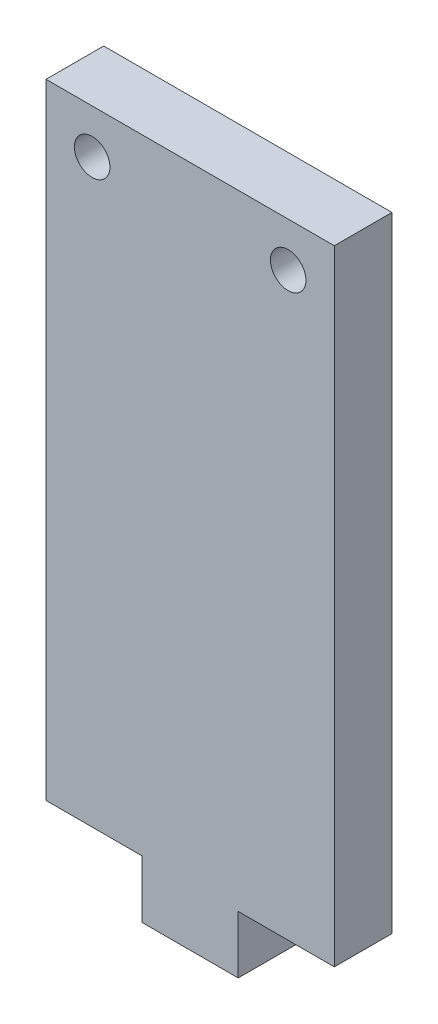
ISO-10303-21;
HEADER;
FILE_DESCRIPTION(('STEP AP214'),'2;1');
FILE_NAME('part.step','',(''),(''),'','','');
FILE_SCHEMA(('AUTOMOTIVE_DESIGN { 1 0 10303 214 1 1 1 1 }'));
ENDSEC;
DATA;
#1=APPLICATION_CONTEXT('core data for automotive mechanical design processes');
#2=APPLICATION_PROTOCOL_DEFINITION('international standard','automotive_design',2000,#1);
#3=PRODUCT_CONTEXT('',#1,'mechanical');
#4=PRODUCT('Part','Part','',(#3));
#5=PRODUCT_RELATED_PRODUCT_CATEGORY('part','',(#4));
#6=PRODUCT_DEFINITION_FORMATION('','',#4);
#7=PRODUCT_DEFINITION_CONTEXT('part definition',#1,'design');
#8=PRODUCT_DEFINITION('design','',#6,#7);
#9=PRODUCT_DEFINITION_SHAPE('','',#8);
#10=(LENGTH_UNIT() NAMED_UNIT(*) SI_UNIT(.MILLI.,.METRE.));
#11=(NAMED_UNIT(*) PLANE_ANGLE_UNIT() SI_UNIT($,.RADIAN.));
#12=(NAMED_UNIT(*) SI_UNIT($,.STERADIAN.) SOLID_ANGLE_UNIT());
#13=UNCERTAINTY_MEASURE_WITH_UNIT(LENGTH_MEASURE(1.E-05),#10,'distance_accuracy_value','');
#14=(GEOMETRIC_REPRESENTATION_CONTEXT(3) GLOBAL_UNCERTAINTY_ASSIGNED_CONTEXT((#13)) GLOBAL_UNIT_ASSIGNED_CONTEXT((#10,
#11,#12)) REPRESENTATION_CONTEXT('',''));
#15=CARTESIAN_POINT('',(0.,0.,0.));
#16=DIRECTION('',(0.,0.,1.));
#17=DIRECTION('',(1.,0.,0.));
#18=AXIS2_PLACEMENT_3D('',#15,#16,#17);
#19=CARTESIAN_POINT('',(0.,0.,6.));
#20=DIRECTION('',(-1.,0.,0.));
#21=DIRECTION('',(0.,-1.,0.));
#22=AXIS2_PLACEMENT_3D('',#19,#20,#21);
#23=PLANE('',#22);
#24=DIRECTION('',(0.,1.,0.));
#25=VECTOR('',#24,1.);
#26=CARTESIAN_POINT('',(0.,0.,6.));
#27=LINE('',#26,#25);
#28=CARTESIAN_POINT('',(0.,6.,6.));
#29=VERTEX_POINT('',#28);
#30=CARTESIAN_POINT('',(0.,71.,6.));
#31=VERTEX_POINT('',#30);
#32=EDGE_CURVE('E124',#29,#31,#27,.T.);
#33=ORIENTED_EDGE('',*,*,#32,.F.);
#34=DIRECTION('',(0.,0.,-1.));
#35=VECTOR('',#34,1.);
#36=CARTESIAN_POINT('',(0.,6.,6.));
#37=LINE('',#36,#35);
#38=CARTESIAN_POINT('',(0.,6.,0.));
#39=VERTEX_POINT('',#38);
#40=EDGE_CURVE('E131',#29,#39,#37,.T.);
#41=ORIENTED_EDGE('',*,*,#40,.T.);
#42=DIRECTION('',(0.,1.,0.));
#43=VECTOR('',#42,1.);
#44=CARTESIAN_POINT('',(0.,0.,0.));
#45=LINE('',#44,#43);
#46=CARTESIAN_POINT('',(0.,71.,0.));
#47=VERTEX_POINT('',#46);
#48=EDGE_CURVE('E128',#39,#47,#45,.T.);
#49=ORIENTED_EDGE('',*,*,#48,.T.);
#50=DIRECTION('',(0.,0.,-1.));
#51=VECTOR('',#50,1.);
#52=CARTESIAN_POINT('',(0.,71.,6.));
#53=LINE('',#52,#51);
#54=EDGE_CURVE('E11',#31,#47,#53,.T.);
#55=ORIENTED_EDGE('',*,*,#54,.F.);
#56=EDGE_LOOP('',(#33,#41,#49,#55));
#57=FACE_BOUND('',#56,.T.);
#58=ADVANCED_FACE('F33',(#57),#23,.F.);
#59=CARTESIAN_POINT('',(0.,71.,6.));
#60=DIRECTION('',(0.,-1.,0.));
#61=DIRECTION('',(0.,0.,-1.));
#62=AXIS2_PLACEMENT_3D('',#59,#60,#61);
#63=PLANE('',#62);
#64=DIRECTION('',(-1.,0.,0.));
#65=VECTOR('',#64,1.);
#66=CARTESIAN_POINT('',(0.,71.,0.));
#67=LINE('',#66,#65);
#68=CARTESIAN_POINT('',(-30.,71.,0.));
#69=VERTEX_POINT('',#68);
#70=EDGE_CURVE('E130',#47,#69,#67,.T.);
#71=ORIENTED_EDGE('',*,*,#70,.T.);
#72=DIRECTION('',(0.,0.,-1.));
#73=VECTOR('',#72,1.);
#74=CARTESIAN_POINT('',(-30.,71.,6.));
#75=LINE('',#74,#73);
#76=CARTESIAN_POINT('',(-30.,71.,6.));
#77=VERTEX_POINT('',#76);
#78=EDGE_CURVE('E40',#77,#69,#75,.T.);
#79=ORIENTED_EDGE('',*,*,#78,.F.);
#80=DIRECTION('',(-1.,0.,0.));
#81=VECTOR('',#80,1.);
#82=CARTESIAN_POINT('',(0.,71.,6.));
#83=LINE('',#82,#81);
#84=EDGE_CURVE('E119',#31,#77,#83,.T.);
#85=ORIENTED_EDGE('',*,*,#84,.F.);
#86=ORIENTED_EDGE('',*,*,#54,.T.);
#87=EDGE_LOOP('',(#71,#79,#85,#86));
#88=FACE_BOUND('',#87,.T.);
#89=ADVANCED_FACE('F172',(#88),#63,.F.);
#90=CARTESIAN_POINT('',(-30.,0.,6.));
#91=DIRECTION('',(1.,0.,0.));
#92=DIRECTION('',(0.,0.,-1.));
#93=AXIS2_PLACEMENT_3D('',#90,#91,#92);
#94=PLANE('',#93);
#95=DIRECTION('',(0.,-1.,0.));
#96=VECTOR('',#95,1.);
#97=CARTESIAN_POINT('',(-30.,0.,0.));
#98=LINE('',#97,#96);
#99=CARTESIAN_POINT('',(-30.,6.,0.));
#100=VERTEX_POINT('',#99);
#101=EDGE_CURVE('E115',#69,#100,#98,.T.);
#102=ORIENTED_EDGE('',*,*,#101,.T.);
#103=DIRECTION('',(0.,0.,-1.));
#104=VECTOR('',#103,1.);
#105=CARTESIAN_POINT('',(-30.,6.,6.));
#106=LINE('',#105,#104);
#107=CARTESIAN_POINT('',(-30.,6.,6.));
#108=VERTEX_POINT('',#107);
#109=EDGE_CURVE('E47',#108,#100,#106,.T.);
#110=ORIENTED_EDGE('',*,*,#109,.F.);
#111=DIRECTION('',(0.,-1.,0.));
#112=VECTOR('',#111,1.);
#113=CARTESIAN_POINT('',(-30.,0.,6.));
#114=LINE('',#113,#112);
#115=EDGE_CURVE('E113',#77,#108,#114,.T.);
#116=ORIENTED_EDGE('',*,*,#115,.F.);
#117=ORIENTED_EDGE('',*,*,#78,.T.);
#118=EDGE_LOOP('',(#102,#110,#116,#117));
#119=FACE_BOUND('',#118,.T.);
#120=ADVANCED_FACE('F111',(#119),#94,.F.);
#121=CARTESIAN_POINT('',(0.,0.,6.));
#122=DIRECTION('',(0.,1.,0.));
#123=DIRECTION('',(-1.,0.,0.));
#124=AXIS2_PLACEMENT_3D('',#121,#122,#123);
#125=PLANE('',#124);
#126=DIRECTION('',(1.,0.,0.));
#127=VECTOR('',#126,1.);
#128=CARTESIAN_POINT('',(0.,0.,6.));
#129=LINE('',#128,#127);
#130=CARTESIAN_POINT('',(-20.,0.,6.));
#131=VERTEX_POINT('',#130);
#132=CARTESIAN_POINT('',(-10.,0.,6.));
#133=VERTEX_POINT('',#132);
#134=EDGE_CURVE('E121',#131,#133,#129,.T.);
#135=ORIENTED_EDGE('',*,*,#134,.F.);
#136=DIRECTION('',(0.,0.,-1.));
#137=VECTOR('',#136,1.);
#138=CARTESIAN_POINT('',(-20.,0.,6.));
#139=LINE('',#138,#137);
#140=CARTESIAN_POINT('',(-20.,0.,0.));
#141=VERTEX_POINT('',#140);
#142=EDGE_CURVE('E149',#131,#141,#139,.T.);
#143=ORIENTED_EDGE('',*,*,#142,.T.);
#144=DIRECTION('',(1.,0.,0.));
#145=VECTOR('',#144,1.);
#146=CARTESIAN_POINT('',(0.,0.,0.));
#147=LINE('',#146,#145);
#148=CARTESIAN_POINT('',(-10.,0.,0.));
#149=VERTEX_POINT('',#148);
#150=EDGE_CURVE('E55',#141,#149,#147,.T.);
#151=ORIENTED_EDGE('',*,*,#150,.T.);
#152=DIRECTION('',(0.,0.,-1.));
#153=VECTOR('',#152,1.);
#154=CARTESIAN_POINT('',(-10.,0.,6.));
#155=LINE('',#154,#153);
#156=EDGE_CURVE('E160',#133,#149,#155,.T.);
#157=ORIENTED_EDGE('',*,*,#156,.F.);
#158=EDGE_LOOP('',(#135,#143,#151,#157));
#159=FACE_BOUND('',#158,.T.);
#160=ADVANCED_FACE('F181',(#159),#125,.F.);
#161=CARTESIAN_POINT('',(0.,0.,6.));
#162=DIRECTION('',(0.,0.,1.));
#163=DIRECTION('',(1.,0.,0.));
#164=AXIS2_PLACEMENT_3D('',#161,#162,#163);
#165=PLANE('',#164);
#166=CARTESIAN_POINT('',(-25.2,66.4,6.));
#167=DIRECTION('',(0.,0.,-1.));
#168=DIRECTION('',(-1.,0.,0.));
#169=AXIS2_PLACEMENT_3D('',#166,#167,#168);
#170=CIRCLE('',#169,1.85);
#171=CARTESIAN_POINT('',(-27.05,66.4,6.));
#172=VERTEX_POINT('',#171);
#173=EDGE_CURVE('E255',#172,#172,#170,.T.);
#174=ORIENTED_EDGE('',*,*,#173,.T.);
#175=EDGE_LOOP('',(#174));
#176=FACE_BOUND('',#175,.T.);
#177=CARTESIAN_POINT('',(-4.8,66.4,6.));
#178=DIRECTION('',(0.,0.,-1.));
#179=DIRECTION('',(-1.,0.,0.));
#180=AXIS2_PLACEMENT_3D('',#177,#178,#179);
#181=CIRCLE('',#180,1.85);
#182=CARTESIAN_POINT('',(-6.65,66.4,6.));
#183=VERTEX_POINT('',#182);
#184=EDGE_CURVE('E141',#183,#183,#181,.T.);
#185=ORIENTED_EDGE('',*,*,#184,.T.);
#186=EDGE_LOOP('',(#185));
#187=FACE_BOUND('',#186,.T.);
#188=DIRECTION('',(0.,-1.,0.));
#189=VECTOR('',#188,1.);
#190=CARTESIAN_POINT('',(-20.,0.,6.));
#191=LINE('',#190,#189);
#192=CARTESIAN_POINT('',(-20.,6.,6.));
#193=VERTEX_POINT('',#192);
#194=EDGE_CURVE('E105',#193,#131,#191,.T.);
#195=ORIENTED_EDGE('',*,*,#194,.T.);
#196=ORIENTED_EDGE('',*,*,#134,.T.);
#197=DIRECTION('',(0.,1.,0.));
#198=VECTOR('',#197,1.);
#199=CARTESIAN_POINT('',(-10.,0.,6.));
#200=LINE('',#199,#198);
#201=CARTESIAN_POINT('',(-10.,6.,6.));
#202=VERTEX_POINT('',#201);
#203=EDGE_CURVE('E153',#133,#202,#200,.T.);
#204=ORIENTED_EDGE('',*,*,#203,.T.);
#205=DIRECTION('',(1.,0.,0.));
#206=VECTOR('',#205,1.);
#207=CARTESIAN_POINT('',(0.,6.,6.));
#208=LINE('',#207,#206);
#209=EDGE_CURVE('E156',#202,#29,#208,.T.);
#210=ORIENTED_EDGE('',*,*,#209,.T.);
#211=ORIENTED_EDGE('',*,*,#32,.T.);
#212=ORIENTED_EDGE('',*,*,#84,.T.);
#213=ORIENTED_EDGE('',*,*,#115,.T.);
#214=DIRECTION('',(1.,0.,0.));
#215=VECTOR('',#214,1.);
#216=CARTESIAN_POINT('',(-30.,6.,6.));
#217=LINE('',#216,#215);
#218=EDGE_CURVE('E98',#108,#193,#217,.T.);
#219=ORIENTED_EDGE('',*,*,#218,.T.);
#220=EDGE_LOOP('',(#195,#196,#204,#210,#211,#212,#213,#219));
#221=FACE_BOUND('',#220,.T.);
#222=ADVANCED_FACE('F117',(#176,#187,#221),#165,.T.);
#223=CARTESIAN_POINT('',(0.,0.,0.));
#224=DIRECTION('',(0.,0.,1.));
#225=DIRECTION('',(1.,0.,0.));
#226=AXIS2_PLACEMENT_3D('',#223,#224,#225);
#227=PLANE('',#226);
#228=CARTESIAN_POINT('',(-25.2,66.4,0.));
#229=DIRECTION('',(0.,0.,-1.));
#230=DIRECTION('',(-1.,0.,0.));
#231=AXIS2_PLACEMENT_3D('',#228,#229,#230);
#232=CIRCLE('',#231,1.85);
#233=CARTESIAN_POINT('',(-27.05,66.4,0.));
#234=VERTEX_POINT('',#233);
#235=EDGE_CURVE('E258',#234,#234,#232,.T.);
#236=ORIENTED_EDGE('',*,*,#235,.F.);
#237=EDGE_LOOP('',(#236));
#238=FACE_BOUND('',#237,.T.);
#239=CARTESIAN_POINT('',(-4.8,66.4,0.));
#240=DIRECTION('',(0.,0.,-1.));
#241=DIRECTION('',(-1.,0.,0.));
#242=AXIS2_PLACEMENT_3D('',#239,#240,#241);
#243=CIRCLE('',#242,1.85);
#244=CARTESIAN_POINT('',(-6.65,66.4,0.));
#245=VERTEX_POINT('',#244);
#246=EDGE_CURVE('E145',#245,#245,#243,.T.);
#247=ORIENTED_EDGE('',*,*,#246,.F.);
#248=EDGE_LOOP('',(#247));
#249=FACE_BOUND('',#248,.T.);
#250=ORIENTED_EDGE('',*,*,#150,.F.);
#251=DIRECTION('',(0.,-1.,0.));
#252=VECTOR('',#251,1.);
#253=CARTESIAN_POINT('',(-20.,0.,0.));
#254=LINE('',#253,#252);
#255=CARTESIAN_POINT('',(-20.,6.,0.));
#256=VERTEX_POINT('',#255);
#257=EDGE_CURVE('E106',#256,#141,#254,.T.);
#258=ORIENTED_EDGE('',*,*,#257,.F.);
#259=DIRECTION('',(1.,0.,0.));
#260=VECTOR('',#259,1.);
#261=CARTESIAN_POINT('',(-30.,6.,0.));
#262=LINE('',#261,#260);
#263=EDGE_CURVE('E140',#100,#256,#262,.T.);
#264=ORIENTED_EDGE('',*,*,#263,.F.);
#265=ORIENTED_EDGE('',*,*,#101,.F.);
#266=ORIENTED_EDGE('',*,*,#70,.F.);
#267=ORIENTED_EDGE('',*,*,#48,.F.);
#268=DIRECTION('',(1.,0.,0.));
#269=VECTOR('',#268,1.);
#270=CARTESIAN_POINT('',(0.,6.,0.));
#271=LINE('',#270,#269);
#272=CARTESIAN_POINT('',(-10.,6.,0.));
#273=VERTEX_POINT('',#272);
#274=EDGE_CURVE('E157',#273,#39,#271,.T.);
#275=ORIENTED_EDGE('',*,*,#274,.F.);
#276=DIRECTION('',(0.,1.,0.));
#277=VECTOR('',#276,1.);
#278=CARTESIAN_POINT('',(-10.,0.,0.));
#279=LINE('',#278,#277);
#280=EDGE_CURVE('E151',#149,#273,#279,.T.);
#281=ORIENTED_EDGE('',*,*,#280,.F.);
#282=EDGE_LOOP('',(#250,#258,#264,#265,#266,#267,#275,#281));
#283=FACE_BOUND('',#282,.T.);
#284=ADVANCED_FACE('F137',(#238,#249,#283),#227,.F.);
#285=CARTESIAN_POINT('',(0.,6.,6.));
#286=DIRECTION('',(0.,1.,0.));
#287=DIRECTION('',(0.,0.,1.));
#288=AXIS2_PLACEMENT_3D('',#285,#286,#287);
#289=PLANE('',#288);
#290=ORIENTED_EDGE('',*,*,#274,.T.);
#291=ORIENTED_EDGE('',*,*,#40,.F.);
#292=ORIENTED_EDGE('',*,*,#209,.F.);
#293=DIRECTION('',(0.,0.,-1.));
#294=VECTOR('',#293,1.);
#295=CARTESIAN_POINT('',(-10.,6.,6.));
#296=LINE('',#295,#294);
#297=EDGE_CURVE('E166',#202,#273,#296,.T.);
#298=ORIENTED_EDGE('',*,*,#297,.T.);
#299=EDGE_LOOP('',(#290,#291,#292,#298));
#300=FACE_BOUND('',#299,.T.);
#301=ADVANCED_FACE('F176',(#300),#289,.F.);
#302=CARTESIAN_POINT('',(-10.,0.,6.));
#303=DIRECTION('',(-1.,0.,0.));
#304=DIRECTION('',(0.,-1.,0.));
#305=AXIS2_PLACEMENT_3D('',#302,#303,#304);
#306=PLANE('',#305);
#307=ORIENTED_EDGE('',*,*,#280,.T.);
#308=ORIENTED_EDGE('',*,*,#297,.F.);
#309=ORIENTED_EDGE('',*,*,#203,.F.);
#310=ORIENTED_EDGE('',*,*,#156,.T.);
#311=EDGE_LOOP('',(#307,#308,#309,#310));
#312=FACE_BOUND('',#311,.T.);
#313=ADVANCED_FACE('F179',(#312),#306,.F.);
#314=CARTESIAN_POINT('',(-20.,0.,6.));
#315=DIRECTION('',(1.,0.,0.));
#316=DIRECTION('',(0.,0.,-1.));
#317=AXIS2_PLACEMENT_3D('',#314,#315,#316);
#318=PLANE('',#317);
#319=ORIENTED_EDGE('',*,*,#257,.T.);
#320=ORIENTED_EDGE('',*,*,#142,.F.);
#321=ORIENTED_EDGE('',*,*,#194,.F.);
#322=DIRECTION('',(0.,0.,-1.));
#323=VECTOR('',#322,1.);
#324=CARTESIAN_POINT('',(-20.,6.,6.));
#325=LINE('',#324,#323);
#326=EDGE_CURVE('E100',#193,#256,#325,.T.);
#327=ORIENTED_EDGE('',*,*,#326,.T.);
#328=EDGE_LOOP('',(#319,#320,#321,#327));
#329=FACE_BOUND('',#328,.T.);
#330=ADVANCED_FACE('F183',(#329),#318,.F.);
#331=CARTESIAN_POINT('',(-30.,6.,6.));
#332=DIRECTION('',(0.,1.,0.));
#333=DIRECTION('',(-1.,0.,0.));
#334=AXIS2_PLACEMENT_3D('',#331,#332,#333);
#335=PLANE('',#334);
#336=ORIENTED_EDGE('',*,*,#263,.T.);
#337=ORIENTED_EDGE('',*,*,#326,.F.);
#338=ORIENTED_EDGE('',*,*,#218,.F.);
#339=ORIENTED_EDGE('',*,*,#109,.T.);
#340=EDGE_LOOP('',(#336,#337,#338,#339));
#341=FACE_BOUND('',#340,.T.);
#342=ADVANCED_FACE('F99',(#341),#335,.F.);
#343=CARTESIAN_POINT('',(-4.8,66.4,6.));
#344=DIRECTION('',(0.,0.,-1.));
#345=DIRECTION('',(-1.,0.,0.));
#346=AXIS2_PLACEMENT_3D('',#343,#344,#345);
#347=CYLINDRICAL_SURFACE('',#346,1.85);
#348=ORIENTED_EDGE('',*,*,#184,.F.);
#349=EDGE_LOOP('',(#348));
#350=FACE_BOUND('',#349,.T.);
#351=ORIENTED_EDGE('',*,*,#246,.T.);
#352=EDGE_LOOP('',(#351));
#353=FACE_BOUND('',#352,.T.);
#354=ADVANCED_FACE('F190',(#350,#353),#347,.F.);
#355=CARTESIAN_POINT('',(-25.2,66.4,6.));
#356=DIRECTION('',(0.,0.,-1.));
#357=DIRECTION('',(-1.,0.,0.));
#358=AXIS2_PLACEMENT_3D('',#355,#356,#357);
#359=CYLINDRICAL_SURFACE('',#358,1.85);
#360=ORIENTED_EDGE('',*,*,#173,.F.);
#361=EDGE_LOOP('',(#360));
#362=FACE_BOUND('',#361,.T.);
#363=ORIENTED_EDGE('',*,*,#235,.T.);
#364=EDGE_LOOP('',(#363));
#365=FACE_BOUND('',#364,.T.);
#366=ADVANCED_FACE('F239',(#362,#365),#359,.F.);
#367=CLOSED_SHELL('',(#58,#89,#120,#160,#222,#284,#301,#313,#330,#342,#354,#366));
#368=MANIFOLD_SOLID_BREP('B2',#367);
#369=ADVANCED_BREP_SHAPE_REPRESENTATION('',(#18,#368),#14);
#370=SHAPE_DEFINITION_REPRESENTATION(#9,#369);
ENDSEC;
END-ISO-10303-21;
